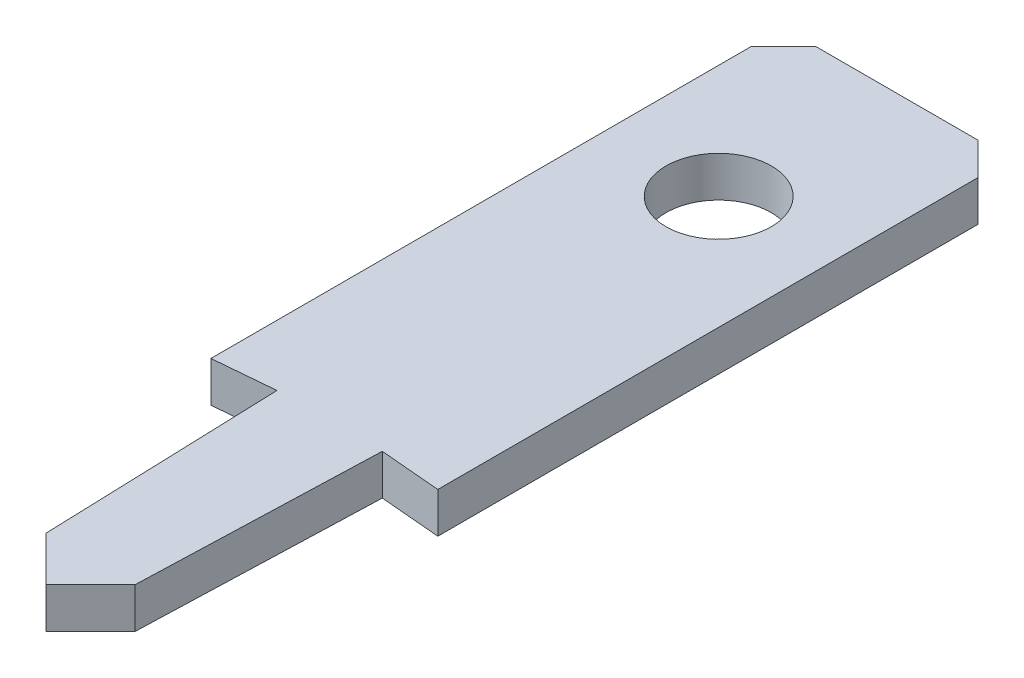
ISO-10303-21;
HEADER;
FILE_DESCRIPTION(('STEP AP214'),'2;1');
FILE_NAME('part.step','',(''),(''),'','','');
FILE_SCHEMA(('AUTOMOTIVE_DESIGN { 1 0 10303 214 1 1 1 1 }'));
ENDSEC;
DATA;
#1=APPLICATION_CONTEXT('core data for automotive mechanical design processes');
#2=APPLICATION_PROTOCOL_DEFINITION('international standard','automotive_design',2000,#1);
#3=PRODUCT_CONTEXT('',#1,'mechanical');
#4=PRODUCT('Part','Part','',(#3));
#5=PRODUCT_RELATED_PRODUCT_CATEGORY('part','',(#4));
#6=PRODUCT_DEFINITION_FORMATION('','',#4);
#7=PRODUCT_DEFINITION_CONTEXT('part definition',#1,'design');
#8=PRODUCT_DEFINITION('design','',#6,#7);
#9=PRODUCT_DEFINITION_SHAPE('','',#8);
#10=(LENGTH_UNIT() NAMED_UNIT(*) SI_UNIT(.MILLI.,.METRE.));
#11=(NAMED_UNIT(*) PLANE_ANGLE_UNIT() SI_UNIT($,.RADIAN.));
#12=(NAMED_UNIT(*) SI_UNIT($,.STERADIAN.) SOLID_ANGLE_UNIT());
#13=UNCERTAINTY_MEASURE_WITH_UNIT(LENGTH_MEASURE(1.E-05),#10,'distance_accuracy_value','');
#14=(GEOMETRIC_REPRESENTATION_CONTEXT(3) GLOBAL_UNCERTAINTY_ASSIGNED_CONTEXT((#13)) GLOBAL_UNIT_ASSIGNED_CONTEXT((#10,
#11,#12)) REPRESENTATION_CONTEXT('',''));
#15=CARTESIAN_POINT('',(0.,0.,0.));
#16=DIRECTION('',(0.,0.,1.));
#17=DIRECTION('',(1.,0.,0.));
#18=AXIS2_PLACEMENT_3D('',#15,#16,#17);
#19=CARTESIAN_POINT('',(1.4,0.5,-6.59999999999999));
#20=DIRECTION('',(-0.707106781186552,0.,0.707106781186544));
#21=DIRECTION('',(0.707106781186544,0.,0.707106781186552));
#22=AXIS2_PLACEMENT_3D('',#19,#20,#21);
#23=PLANE('',#22);
#24=DIRECTION('',(-0.707106781186544,0.,-0.707106781186552));
#25=VECTOR('',#24,1.);
#26=CARTESIAN_POINT('',(1.4,0.,-6.59999999999999));
#27=LINE('',#26,#25);
#28=CARTESIAN_POINT('',(1.4,0.,-6.59999999999999));
#29=VERTEX_POINT('',#28);
#30=CARTESIAN_POINT('',(1.,0.,-7.));
#31=VERTEX_POINT('',#30);
#32=EDGE_CURVE('E167',#29,#31,#27,.T.);
#33=ORIENTED_EDGE('',*,*,#32,.T.);
#34=DIRECTION('',(0.,-1.,0.));
#35=VECTOR('',#34,1.);
#36=CARTESIAN_POINT('',(1.,0.5,-7.));
#37=LINE('',#36,#35);
#38=CARTESIAN_POINT('',(1.,0.5,-7.));
#39=VERTEX_POINT('',#38);
#40=EDGE_CURVE('E11',#39,#31,#37,.T.);
#41=ORIENTED_EDGE('',*,*,#40,.F.);
#42=DIRECTION('',(-0.707106781186544,0.,-0.707106781186552));
#43=VECTOR('',#42,1.);
#44=CARTESIAN_POINT('',(1.4,0.5,-6.59999999999999));
#45=LINE('',#44,#43);
#46=CARTESIAN_POINT('',(1.4,0.5,-6.59999999999999));
#47=VERTEX_POINT('',#46);
#48=EDGE_CURVE('E199',#47,#39,#45,.T.);
#49=ORIENTED_EDGE('',*,*,#48,.F.);
#50=DIRECTION('',(0.,-1.,0.));
#51=VECTOR('',#50,1.);
#52=CARTESIAN_POINT('',(1.4,0.5,-6.59999999999999));
#53=LINE('',#52,#51);
#54=EDGE_CURVE('E163',#47,#29,#53,.T.);
#55=ORIENTED_EDGE('',*,*,#54,.T.);
#56=EDGE_LOOP('',(#33,#41,#49,#55));
#57=FACE_BOUND('',#56,.T.);
#58=ADVANCED_FACE('F45',(#57),#23,.F.);
#59=CARTESIAN_POINT('',(-0.999999999999996,0.5,-7.));
#60=DIRECTION('',(0.,0.,1.));
#61=DIRECTION('',(1.,0.,0.));
#62=AXIS2_PLACEMENT_3D('',#59,#60,#61);
#63=PLANE('',#62);
#64=DIRECTION('',(-1.,0.,0.));
#65=VECTOR('',#64,1.);
#66=CARTESIAN_POINT('',(-0.999999999999996,0.,-7.));
#67=LINE('',#66,#65);
#68=CARTESIAN_POINT('',(-0.999999999999996,0.,-7.));
#69=VERTEX_POINT('',#68);
#70=EDGE_CURVE('E171',#31,#69,#67,.T.);
#71=ORIENTED_EDGE('',*,*,#70,.T.);
#72=DIRECTION('',(0.,-1.,0.));
#73=VECTOR('',#72,1.);
#74=CARTESIAN_POINT('',(-0.999999999999996,0.5,-7.));
#75=LINE('',#74,#73);
#76=CARTESIAN_POINT('',(-0.999999999999996,0.5,-7.));
#77=VERTEX_POINT('',#76);
#78=EDGE_CURVE('E54',#77,#69,#75,.T.);
#79=ORIENTED_EDGE('',*,*,#78,.F.);
#80=DIRECTION('',(-1.,0.,0.));
#81=VECTOR('',#80,1.);
#82=CARTESIAN_POINT('',(-0.999999999999996,0.5,-7.));
#83=LINE('',#82,#81);
#84=EDGE_CURVE('E114',#39,#77,#83,.T.);
#85=ORIENTED_EDGE('',*,*,#84,.F.);
#86=ORIENTED_EDGE('',*,*,#40,.T.);
#87=EDGE_LOOP('',(#71,#79,#85,#86));
#88=FACE_BOUND('',#87,.T.);
#89=ADVANCED_FACE('F302',(#88),#63,.F.);
#90=CARTESIAN_POINT('',(-1.4,0.5,-6.59999999999999));
#91=DIRECTION('',(0.707106781186552,0.,0.707106781186544));
#92=DIRECTION('',(0.707106781186544,0.,-0.707106781186552));
#93=AXIS2_PLACEMENT_3D('',#90,#91,#92);
#94=PLANE('',#93);
#95=DIRECTION('',(-0.707106781186544,0.,0.707106781186552));
#96=VECTOR('',#95,1.);
#97=CARTESIAN_POINT('',(-1.4,0.,-6.59999999999999));
#98=LINE('',#97,#96);
#99=CARTESIAN_POINT('',(-1.4,0.,-6.59999999999999));
#100=VERTEX_POINT('',#99);
#101=EDGE_CURVE('E175',#69,#100,#98,.T.);
#102=ORIENTED_EDGE('',*,*,#101,.T.);
#103=DIRECTION('',(0.,-1.,0.));
#104=VECTOR('',#103,1.);
#105=CARTESIAN_POINT('',(-1.4,0.5,-6.59999999999999));
#106=LINE('',#105,#104);
#107=CARTESIAN_POINT('',(-1.4,0.5,-6.59999999999999));
#108=VERTEX_POINT('',#107);
#109=EDGE_CURVE('E221',#108,#100,#106,.T.);
#110=ORIENTED_EDGE('',*,*,#109,.F.);
#111=DIRECTION('',(-0.707106781186544,0.,0.707106781186552));
#112=VECTOR('',#111,1.);
#113=CARTESIAN_POINT('',(-1.4,0.5,-6.59999999999999));
#114=LINE('',#113,#112);
#115=EDGE_CURVE('E232',#77,#108,#114,.T.);
#116=ORIENTED_EDGE('',*,*,#115,.F.);
#117=ORIENTED_EDGE('',*,*,#78,.T.);
#118=EDGE_LOOP('',(#102,#110,#116,#117));
#119=FACE_BOUND('',#118,.T.);
#120=ADVANCED_FACE('F230',(#119),#94,.F.);
#121=CARTESIAN_POINT('',(-1.4,0.5,-6.59999999999999));
#122=DIRECTION('',(1.,0.,0.));
#123=DIRECTION('',(0.,0.,-1.));
#124=AXIS2_PLACEMENT_3D('',#121,#122,#123);
#125=PLANE('',#124);
#126=DIRECTION('',(0.,0.,1.));
#127=VECTOR('',#126,1.);
#128=CARTESIAN_POINT('',(-1.4,0.,-6.59999999999999));
#129=LINE('',#128,#127);
#130=CARTESIAN_POINT('',(-1.4,0.,0.0656164976444378));
#131=VERTEX_POINT('',#130);
#132=EDGE_CURVE('E178',#100,#131,#129,.T.);
#133=ORIENTED_EDGE('',*,*,#132,.T.);
#134=DIRECTION('',(0.,-1.,0.));
#135=VECTOR('',#134,1.);
#136=CARTESIAN_POINT('',(-1.4,0.5,0.0656164976444378));
#137=LINE('',#136,#135);
#138=CARTESIAN_POINT('',(-1.4,0.5,0.0656164976444378));
#139=VERTEX_POINT('',#138);
#140=EDGE_CURVE('E217',#139,#131,#137,.T.);
#141=ORIENTED_EDGE('',*,*,#140,.F.);
#142=DIRECTION('',(0.,0.,1.));
#143=VECTOR('',#142,1.);
#144=CARTESIAN_POINT('',(-1.4,0.5,-6.59999999999999));
#145=LINE('',#144,#143);
#146=EDGE_CURVE('E251',#108,#139,#145,.T.);
#147=ORIENTED_EDGE('',*,*,#146,.F.);
#148=ORIENTED_EDGE('',*,*,#109,.T.);
#149=EDGE_LOOP('',(#133,#141,#147,#148));
#150=FACE_BOUND('',#149,.T.);
#151=ADVANCED_FACE('F241',(#150),#125,.F.);
#152=CARTESIAN_POINT('',(-1.4,0.5,0.0656164976444378));
#153=DIRECTION('',(-0.0871557427476514,0.,-0.996194698091746));
#154=DIRECTION('',(-0.996194698091746,0.,0.0871557427476514));
#155=AXIS2_PLACEMENT_3D('',#152,#153,#154);
#156=PLANE('',#155);
#157=DIRECTION('',(0.996194698091746,0.,-0.0871557427476513));
#158=VECTOR('',#157,1.);
#159=CARTESIAN_POINT('',(-1.4,0.,0.0656164976444378));
#160=LINE('',#159,#158);
#161=CARTESIAN_POINT('',(-0.650000000000005,0.,0.));
#162=VERTEX_POINT('',#161);
#163=EDGE_CURVE('E181',#131,#162,#160,.T.);
#164=ORIENTED_EDGE('',*,*,#163,.T.);
#165=DIRECTION('',(0.,-1.,0.));
#166=VECTOR('',#165,1.);
#167=CARTESIAN_POINT('',(-0.650000000000005,0.5,0.));
#168=LINE('',#167,#166);
#169=CARTESIAN_POINT('',(-0.650000000000005,0.5,0.));
#170=VERTEX_POINT('',#169);
#171=EDGE_CURVE('E213',#170,#162,#168,.T.);
#172=ORIENTED_EDGE('',*,*,#171,.F.);
#173=DIRECTION('',(0.996194698091746,0.,-0.0871557427476513));
#174=VECTOR('',#173,1.);
#175=CARTESIAN_POINT('',(-1.4,0.5,0.0656164976444378));
#176=LINE('',#175,#174);
#177=EDGE_CURVE('E247',#139,#170,#176,.T.);
#178=ORIENTED_EDGE('',*,*,#177,.F.);
#179=ORIENTED_EDGE('',*,*,#140,.T.);
#180=EDGE_LOOP('',(#164,#172,#178,#179));
#181=FACE_BOUND('',#180,.T.);
#182=ADVANCED_FACE('F245',(#181),#156,.F.);
#183=CARTESIAN_POINT('',(-0.650000000000005,0.5,0.));
#184=DIRECTION('',(0.999425947139835,0.,-0.033878845665757));
#185=DIRECTION('',(-0.033878845665757,0.,-0.999425947139835));
#186=AXIS2_PLACEMENT_3D('',#183,#184,#185);
#187=PLANE('',#186);
#188=DIRECTION('',(0.033878845665757,0.,0.999425947139835));
#189=VECTOR('',#188,1.);
#190=CARTESIAN_POINT('',(-0.650000000000005,0.,0.));
#191=LINE('',#190,#189);
#192=CARTESIAN_POINT('',(-0.550000000000005,0.,2.95000000000001));
#193=VERTEX_POINT('',#192);
#194=EDGE_CURVE('E184',#162,#193,#191,.T.);
#195=ORIENTED_EDGE('',*,*,#194,.T.);
#196=DIRECTION('',(0.,-1.,0.));
#197=VECTOR('',#196,1.);
#198=CARTESIAN_POINT('',(-0.550000000000005,0.5,2.95000000000001));
#199=LINE('',#198,#197);
#200=CARTESIAN_POINT('',(-0.550000000000005,0.5,2.95000000000001));
#201=VERTEX_POINT('',#200);
#202=EDGE_CURVE('E209',#201,#193,#199,.T.);
#203=ORIENTED_EDGE('',*,*,#202,.F.);
#204=DIRECTION('',(0.033878845665757,0.,0.999425947139835));
#205=VECTOR('',#204,1.);
#206=CARTESIAN_POINT('',(-0.650000000000005,0.5,0.));
#207=LINE('',#206,#205);
#208=EDGE_CURVE('E250',#170,#201,#207,.T.);
#209=ORIENTED_EDGE('',*,*,#208,.F.);
#210=ORIENTED_EDGE('',*,*,#171,.T.);
#211=EDGE_LOOP('',(#195,#203,#209,#210));
#212=FACE_BOUND('',#211,.T.);
#213=ADVANCED_FACE('F314',(#212),#187,.F.);
#214=CARTESIAN_POINT('',(-0.550000000000005,0.5,2.95000000000001));
#215=DIRECTION('',(0.707106781186538,0.,-0.707106781186557));
#216=DIRECTION('',(-0.707106781186557,0.,-0.707106781186538));
#217=AXIS2_PLACEMENT_3D('',#214,#215,#216);
#218=PLANE('',#217);
#219=DIRECTION('',(0.707106781186557,0.,0.707106781186538));
#220=VECTOR('',#219,1.);
#221=CARTESIAN_POINT('',(-0.550000000000005,0.,2.95000000000001));
#222=LINE('',#221,#220);
#223=CARTESIAN_POINT('',(0.,0.,3.5));
#224=VERTEX_POINT('',#223);
#225=EDGE_CURVE('E187',#193,#224,#222,.T.);
#226=ORIENTED_EDGE('',*,*,#225,.T.);
#227=DIRECTION('',(0.,-1.,0.));
#228=VECTOR('',#227,1.);
#229=CARTESIAN_POINT('',(0.,0.5,3.5));
#230=LINE('',#229,#228);
#231=CARTESIAN_POINT('',(0.,0.5,3.5));
#232=VERTEX_POINT('',#231);
#233=EDGE_CURVE('E205',#232,#224,#230,.T.);
#234=ORIENTED_EDGE('',*,*,#233,.F.);
#235=DIRECTION('',(0.707106781186557,0.,0.707106781186538));
#236=VECTOR('',#235,1.);
#237=CARTESIAN_POINT('',(-0.550000000000005,0.5,2.95000000000001));
#238=LINE('',#237,#236);
#239=EDGE_CURVE('E255',#201,#232,#238,.T.);
#240=ORIENTED_EDGE('',*,*,#239,.F.);
#241=ORIENTED_EDGE('',*,*,#202,.T.);
#242=EDGE_LOOP('',(#226,#234,#240,#241));
#243=FACE_BOUND('',#242,.T.);
#244=ADVANCED_FACE('F317',(#243),#218,.F.);
#245=CARTESIAN_POINT('',(0.550000000000005,0.5,2.95000000000001));
#246=DIRECTION('',(-0.707106781186544,0.,-0.707106781186551));
#247=DIRECTION('',(-0.707106781186551,0.,0.707106781186544));
#248=AXIS2_PLACEMENT_3D('',#245,#246,#247);
#249=PLANE('',#248);
#250=DIRECTION('',(0.707106781186551,0.,-0.707106781186544));
#251=VECTOR('',#250,1.);
#252=CARTESIAN_POINT('',(0.550000000000005,0.,2.95000000000001));
#253=LINE('',#252,#251);
#254=CARTESIAN_POINT('',(0.550000000000005,0.,2.95000000000001));
#255=VERTEX_POINT('',#254);
#256=EDGE_CURVE('E190',#224,#255,#253,.T.);
#257=ORIENTED_EDGE('',*,*,#256,.T.);
#258=DIRECTION('',(0.,-1.,0.));
#259=VECTOR('',#258,1.);
#260=CARTESIAN_POINT('',(0.550000000000005,0.5,2.95000000000001));
#261=LINE('',#260,#259);
#262=CARTESIAN_POINT('',(0.550000000000005,0.5,2.95000000000001));
#263=VERTEX_POINT('',#262);
#264=EDGE_CURVE('E153',#263,#255,#261,.T.);
#265=ORIENTED_EDGE('',*,*,#264,.F.);
#266=DIRECTION('',(0.707106781186551,0.,-0.707106781186544));
#267=VECTOR('',#266,1.);
#268=CARTESIAN_POINT('',(0.550000000000005,0.5,2.95000000000001));
#269=LINE('',#268,#267);
#270=EDGE_CURVE('E142',#232,#263,#269,.T.);
#271=ORIENTED_EDGE('',*,*,#270,.F.);
#272=ORIENTED_EDGE('',*,*,#233,.T.);
#273=EDGE_LOOP('',(#257,#265,#271,#272));
#274=FACE_BOUND('',#273,.T.);
#275=ADVANCED_FACE('F321',(#274),#249,.F.);
#276=CARTESIAN_POINT('',(0.650000000000005,0.5,0.));
#277=DIRECTION('',(-0.999425947139835,0.,-0.033878845665757));
#278=DIRECTION('',(-0.033878845665757,0.,0.999425947139835));
#279=AXIS2_PLACEMENT_3D('',#276,#277,#278);
#280=PLANE('',#279);
#281=DIRECTION('',(0.033878845665757,0.,-0.999425947139835));
#282=VECTOR('',#281,1.);
#283=CARTESIAN_POINT('',(0.650000000000005,0.,0.));
#284=LINE('',#283,#282);
#285=CARTESIAN_POINT('',(0.650000000000005,0.,0.));
#286=VERTEX_POINT('',#285);
#287=EDGE_CURVE('E151',#255,#286,#284,.T.);
#288=ORIENTED_EDGE('',*,*,#287,.T.);
#289=DIRECTION('',(0.,-1.,0.));
#290=VECTOR('',#289,1.);
#291=CARTESIAN_POINT('',(0.650000000000005,0.5,0.));
#292=LINE('',#291,#290);
#293=CARTESIAN_POINT('',(0.650000000000005,0.5,0.));
#294=VERTEX_POINT('',#293);
#295=EDGE_CURVE('E148',#294,#286,#292,.T.);
#296=ORIENTED_EDGE('',*,*,#295,.F.);
#297=DIRECTION('',(0.033878845665757,0.,-0.999425947139835));
#298=VECTOR('',#297,1.);
#299=CARTESIAN_POINT('',(0.650000000000005,0.5,0.));
#300=LINE('',#299,#298);
#301=EDGE_CURVE('E136',#263,#294,#300,.T.);
#302=ORIENTED_EDGE('',*,*,#301,.F.);
#303=ORIENTED_EDGE('',*,*,#264,.T.);
#304=EDGE_LOOP('',(#288,#296,#302,#303));
#305=FACE_BOUND('',#304,.T.);
#306=ADVANCED_FACE('F149',(#305),#280,.F.);
#307=CARTESIAN_POINT('',(1.4,0.5,0.0656164976444378));
#308=DIRECTION('',(0.0871557427476514,0.,-0.996194698091746));
#309=DIRECTION('',(-0.996194698091746,0.,-0.0871557427476514));
#310=AXIS2_PLACEMENT_3D('',#307,#308,#309);
#311=PLANE('',#310);
#312=DIRECTION('',(0.996194698091746,0.,0.0871557427476513));
#313=VECTOR('',#312,1.);
#314=CARTESIAN_POINT('',(1.4,0.,0.0656164976444378));
#315=LINE('',#314,#313);
#316=CARTESIAN_POINT('',(1.4,0.,0.0656164976444378));
#317=VERTEX_POINT('',#316);
#318=EDGE_CURVE('E100',#286,#317,#315,.T.);
#319=ORIENTED_EDGE('',*,*,#318,.T.);
#320=DIRECTION('',(0.,-1.,0.));
#321=VECTOR('',#320,1.);
#322=CARTESIAN_POINT('',(1.4,0.5,0.0656164976444378));
#323=LINE('',#322,#321);
#324=CARTESIAN_POINT('',(1.4,0.5,0.0656164976444378));
#325=VERTEX_POINT('',#324);
#326=EDGE_CURVE('E154',#325,#317,#323,.T.);
#327=ORIENTED_EDGE('',*,*,#326,.F.);
#328=DIRECTION('',(0.996194698091746,0.,0.0871557427476513));
#329=VECTOR('',#328,1.);
#330=CARTESIAN_POINT('',(1.4,0.5,0.0656164976444378));
#331=LINE('',#330,#329);
#332=EDGE_CURVE('E140',#294,#325,#331,.T.);
#333=ORIENTED_EDGE('',*,*,#332,.F.);
#334=ORIENTED_EDGE('',*,*,#295,.T.);
#335=EDGE_LOOP('',(#319,#327,#333,#334));
#336=FACE_BOUND('',#335,.T.);
#337=ADVANCED_FACE('F156',(#336),#311,.F.);
#338=CARTESIAN_POINT('',(1.4,0.5,-6.59999999999999));
#339=DIRECTION('',(-1.,0.,0.));
#340=DIRECTION('',(0.,0.,1.));
#341=AXIS2_PLACEMENT_3D('',#338,#339,#340);
#342=PLANE('',#341);
#343=DIRECTION('',(0.,0.,-1.));
#344=VECTOR('',#343,1.);
#345=CARTESIAN_POINT('',(1.4,0.,-6.59999999999999));
#346=LINE('',#345,#344);
#347=EDGE_CURVE('E106',#317,#29,#346,.T.);
#348=ORIENTED_EDGE('',*,*,#347,.T.);
#349=ORIENTED_EDGE('',*,*,#54,.F.);
#350=DIRECTION('',(0.,0.,-1.));
#351=VECTOR('',#350,1.);
#352=CARTESIAN_POINT('',(1.4,0.5,-6.59999999999999));
#353=LINE('',#352,#351);
#354=EDGE_CURVE('E62',#325,#47,#353,.T.);
#355=ORIENTED_EDGE('',*,*,#354,.F.);
#356=ORIENTED_EDGE('',*,*,#326,.T.);
#357=EDGE_LOOP('',(#348,#349,#355,#356));
#358=FACE_BOUND('',#357,.T.);
#359=ADVANCED_FACE('F330',(#358),#342,.F.);
#360=CARTESIAN_POINT('',(0.,0.5,0.));
#361=DIRECTION('',(0.,-1.,0.));
#362=DIRECTION('',(0.,0.,-1.));
#363=AXIS2_PLACEMENT_3D('',#360,#361,#362);
#364=PLANE('',#363);
#365=CARTESIAN_POINT('',(0.,0.5,-4.8));
#366=DIRECTION('',(0.,1.,0.));
#367=DIRECTION('',(0.,0.,1.));
#368=AXIS2_PLACEMENT_3D('',#365,#366,#367);
#369=CIRCLE('',#368,0.65);
#370=CARTESIAN_POINT('',(0.,0.5,-4.15));
#371=VERTEX_POINT('',#370);
#372=EDGE_CURVE('E292',#371,#371,#369,.T.);
#373=ORIENTED_EDGE('',*,*,#372,.F.);
#374=EDGE_LOOP('',(#373));
#375=FACE_BOUND('',#374,.T.);
#376=ORIENTED_EDGE('',*,*,#48,.T.);
#377=ORIENTED_EDGE('',*,*,#84,.T.);
#378=ORIENTED_EDGE('',*,*,#115,.T.);
#379=ORIENTED_EDGE('',*,*,#146,.T.);
#380=ORIENTED_EDGE('',*,*,#177,.T.);
#381=ORIENTED_EDGE('',*,*,#208,.T.);
#382=ORIENTED_EDGE('',*,*,#239,.T.);
#383=ORIENTED_EDGE('',*,*,#270,.T.);
#384=ORIENTED_EDGE('',*,*,#301,.T.);
#385=ORIENTED_EDGE('',*,*,#332,.T.);
#386=ORIENTED_EDGE('',*,*,#354,.T.);
#387=EDGE_LOOP('',(#376,#377,#378,#379,#380,#381,#382,#383,#384,#385,#386));
#388=FACE_BOUND('',#387,.T.);
#389=ADVANCED_FACE('F138',(#375,#388),#364,.F.);
#390=CARTESIAN_POINT('',(0.,0.,0.));
#391=DIRECTION('',(0.,-1.,0.));
#392=DIRECTION('',(0.,0.,-1.));
#393=AXIS2_PLACEMENT_3D('',#390,#391,#392);
#394=PLANE('',#393);
#395=CARTESIAN_POINT('',(0.,0.,-4.8));
#396=DIRECTION('',(0.,1.,0.));
#397=DIRECTION('',(0.,0.,1.));
#398=AXIS2_PLACEMENT_3D('',#395,#396,#397);
#399=CIRCLE('',#398,0.65);
#400=CARTESIAN_POINT('',(0.,0.,-4.15));
#401=VERTEX_POINT('',#400);
#402=EDGE_CURVE('E172',#401,#401,#399,.T.);
#403=ORIENTED_EDGE('',*,*,#402,.T.);
#404=EDGE_LOOP('',(#403));
#405=FACE_BOUND('',#404,.T.);
#406=ORIENTED_EDGE('',*,*,#32,.F.);
#407=ORIENTED_EDGE('',*,*,#347,.F.);
#408=ORIENTED_EDGE('',*,*,#318,.F.);
#409=ORIENTED_EDGE('',*,*,#287,.F.);
#410=ORIENTED_EDGE('',*,*,#256,.F.);
#411=ORIENTED_EDGE('',*,*,#225,.F.);
#412=ORIENTED_EDGE('',*,*,#194,.F.);
#413=ORIENTED_EDGE('',*,*,#163,.F.);
#414=ORIENTED_EDGE('',*,*,#132,.F.);
#415=ORIENTED_EDGE('',*,*,#101,.F.);
#416=ORIENTED_EDGE('',*,*,#70,.F.);
#417=EDGE_LOOP('',(#406,#407,#408,#409,#410,#411,#412,#413,#414,#415,#416));
#418=FACE_BOUND('',#417,.T.);
#419=ADVANCED_FACE('F236',(#405,#418),#394,.T.);
#420=CARTESIAN_POINT('',(0.,0.,-4.8));
#421=DIRECTION('',(0.,1.,0.));
#422=DIRECTION('',(0.,0.,1.));
#423=AXIS2_PLACEMENT_3D('',#420,#421,#422);
#424=CYLINDRICAL_SURFACE('',#423,0.65);
#425=ORIENTED_EDGE('',*,*,#402,.F.);
#426=EDGE_LOOP('',(#425));
#427=FACE_BOUND('',#426,.T.);
#428=ORIENTED_EDGE('',*,*,#372,.T.);
#429=EDGE_LOOP('',(#428));
#430=FACE_BOUND('',#429,.T.);
#431=ADVANCED_FACE('F335',(#427,#430),#424,.F.);
#432=CLOSED_SHELL('',(#58,#89,#120,#151,#182,#213,#244,#275,#306,#337,#359,#389,#419,#431));
#433=MANIFOLD_SOLID_BREP('B2',#432);
#434=ADVANCED_BREP_SHAPE_REPRESENTATION('',(#18,#433),#14);
#435=SHAPE_DEFINITION_REPRESENTATION(#9,#434);
ENDSEC;
END-ISO-10303-21;
